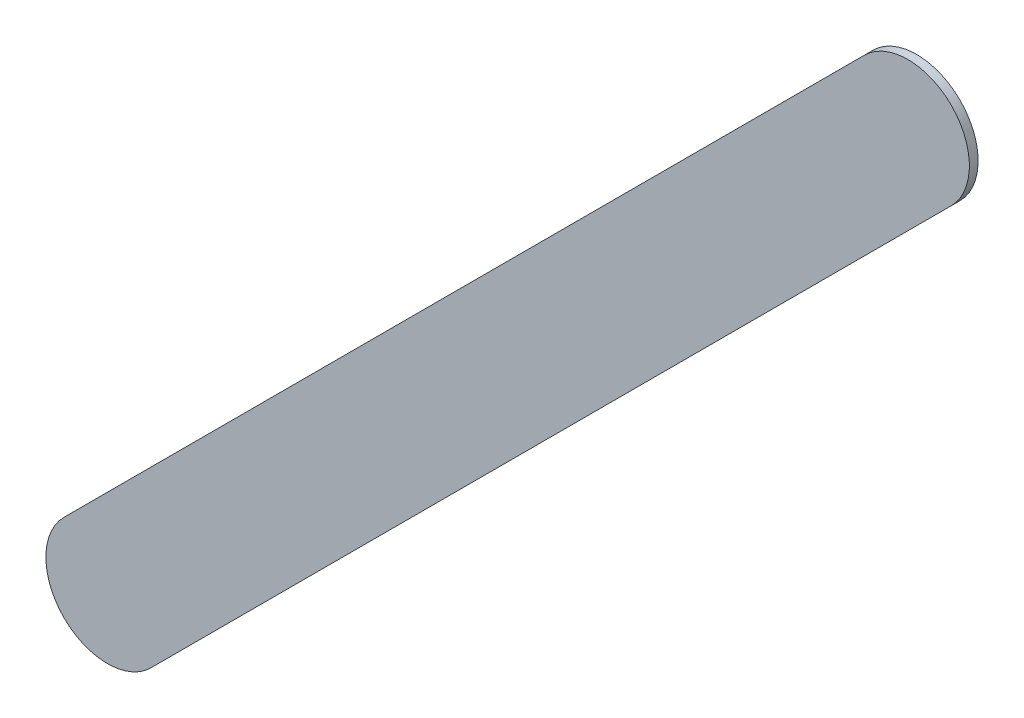
ISO-10303-21;
HEADER;
FILE_DESCRIPTION(('STEP AP214'),'2;1');
FILE_NAME('part.step','',(''),(''),'','','');
FILE_SCHEMA(('AUTOMOTIVE_DESIGN { 1 0 10303 214 1 1 1 1 }'));
ENDSEC;
DATA;
#1=APPLICATION_CONTEXT('core data for automotive mechanical design processes');
#2=APPLICATION_PROTOCOL_DEFINITION('international standard','automotive_design',2000,#1);
#3=PRODUCT_CONTEXT('',#1,'mechanical');
#4=PRODUCT('Part','Part','',(#3));
#5=PRODUCT_RELATED_PRODUCT_CATEGORY('part','',(#4));
#6=PRODUCT_DEFINITION_FORMATION('','',#4);
#7=PRODUCT_DEFINITION_CONTEXT('part definition',#1,'design');
#8=PRODUCT_DEFINITION('design','',#6,#7);
#9=PRODUCT_DEFINITION_SHAPE('','',#8);
#10=(LENGTH_UNIT() NAMED_UNIT(*) SI_UNIT(.MILLI.,.METRE.));
#11=(NAMED_UNIT(*) PLANE_ANGLE_UNIT() SI_UNIT($,.RADIAN.));
#12=(NAMED_UNIT(*) SI_UNIT($,.STERADIAN.) SOLID_ANGLE_UNIT());
#13=UNCERTAINTY_MEASURE_WITH_UNIT(LENGTH_MEASURE(1.E-05),#10,'distance_accuracy_value','');
#14=(GEOMETRIC_REPRESENTATION_CONTEXT(3) GLOBAL_UNCERTAINTY_ASSIGNED_CONTEXT((#13)) GLOBAL_UNIT_ASSIGNED_CONTEXT((#10,
#11,#12)) REPRESENTATION_CONTEXT('',''));
#15=CARTESIAN_POINT('',(0.,0.,0.));
#16=DIRECTION('',(0.,0.,1.));
#17=DIRECTION('',(1.,0.,0.));
#18=AXIS2_PLACEMENT_3D('',#15,#16,#17);
#19=CARTESIAN_POINT('',(87.72410954,109.8009869,0.));
#20=DIRECTION('',(-0.707106781186548,0.707106781186548,0.));
#21=DIRECTION('',(0.707106781186548,0.707106781186548,0.));
#22=AXIS2_PLACEMENT_3D('',#19,#20,#21);
#23=PLANE('',#22);
#24=DIRECTION('',(0.707106781186548,0.707106781186548,0.));
#25=VECTOR('',#24,1.);
#26=CARTESIAN_POINT('',(87.72410954,109.8009869,0.03556));
#27=LINE('',#26,#25);
#28=CARTESIAN_POINT('',(87.72410954,109.8009869,0.03556));
#29=VERTEX_POINT('',#28);
#30=CARTESIAN_POINT('',(90.98035652,113.05723388,0.03556));
#31=VERTEX_POINT('',#30);
#32=EDGE_CURVE('E11',#29,#31,#27,.T.);
#33=ORIENTED_EDGE('',*,*,#32,.F.);
#34=DIRECTION('',(0.,0.,1.));
#35=VECTOR('',#34,1.);
#36=CARTESIAN_POINT('',(87.72410954,109.8009869,0.));
#37=LINE('',#36,#35);
#38=CARTESIAN_POINT('',(87.72410954,109.8009869,0.));
#39=VERTEX_POINT('',#38);
#40=EDGE_CURVE('E24',#39,#29,#37,.T.);
#41=ORIENTED_EDGE('',*,*,#40,.F.);
#42=DIRECTION('',(0.707106781186548,0.707106781186548,0.));
#43=VECTOR('',#42,1.);
#44=CARTESIAN_POINT('',(87.72410954,109.8009869,0.));
#45=LINE('',#44,#43);
#46=CARTESIAN_POINT('',(90.98035652,113.05723388,0.));
#47=VERTEX_POINT('',#46);
#48=EDGE_CURVE('E75',#39,#47,#45,.T.);
#49=ORIENTED_EDGE('',*,*,#48,.T.);
#50=DIRECTION('',(0.,0.,1.));
#51=VECTOR('',#50,1.);
#52=CARTESIAN_POINT('',(90.98035652,113.05723388,0.));
#53=LINE('',#52,#51);
#54=EDGE_CURVE('E37',#47,#31,#53,.T.);
#55=ORIENTED_EDGE('',*,*,#54,.T.);
#56=EDGE_LOOP('',(#33,#41,#49,#55));
#57=FACE_BOUND('',#56,.T.);
#58=ADVANCED_FACE('F17',(#57),#23,.F.);
#59=CARTESIAN_POINT('',(90.80358014,113.23401026,0.));
#60=DIRECTION('',(0.,0.,-1.));
#61=DIRECTION('',(0.707106781186576,-0.707106781186519,0.));
#62=AXIS2_PLACEMENT_3D('',#59,#60,#61);
#63=CYLINDRICAL_SURFACE('',#62,0.249999554103226);
#64=CARTESIAN_POINT('',(90.80358014,113.23401026,0.03556));
#65=DIRECTION('',(0.,0.,1.));
#66=DIRECTION('',(0.707106781186576,-0.707106781186519,0.));
#67=AXIS2_PLACEMENT_3D('',#64,#65,#66);
#68=CIRCLE('',#67,0.249999554103226);
#69=CARTESIAN_POINT('',(90.62680376,113.41078664,0.03556));
#70=VERTEX_POINT('',#69);
#71=EDGE_CURVE('E83',#31,#70,#68,.T.);
#72=ORIENTED_EDGE('',*,*,#71,.F.);
#73=ORIENTED_EDGE('',*,*,#54,.F.);
#74=CARTESIAN_POINT('',(90.80358014,113.23401026,0.));
#75=DIRECTION('',(0.,0.,1.));
#76=DIRECTION('',(0.707106781186576,-0.707106781186519,0.));
#77=AXIS2_PLACEMENT_3D('',#74,#75,#76);
#78=CIRCLE('',#77,0.249999554103226);
#79=CARTESIAN_POINT('',(90.62680376,113.41078664,0.));
#80=VERTEX_POINT('',#79);
#81=EDGE_CURVE('E81',#47,#80,#78,.T.);
#82=ORIENTED_EDGE('',*,*,#81,.T.);
#83=DIRECTION('',(0.,0.,1.));
#84=VECTOR('',#83,1.);
#85=CARTESIAN_POINT('',(90.62680376,113.41078664,0.));
#86=LINE('',#85,#84);
#87=EDGE_CURVE('E67',#80,#70,#86,.T.);
#88=ORIENTED_EDGE('',*,*,#87,.T.);
#89=EDGE_LOOP('',(#72,#73,#82,#88));
#90=FACE_BOUND('',#89,.T.);
#91=ADVANCED_FACE('F89',(#90),#63,.T.);
#92=CARTESIAN_POINT('',(90.62680376,113.41078664,0.));
#93=DIRECTION('',(0.707106781186551,-0.707106781186544,0.));
#94=DIRECTION('',(-0.707106781186544,-0.707106781186551,0.));
#95=AXIS2_PLACEMENT_3D('',#92,#93,#94);
#96=PLANE('',#95);
#97=DIRECTION('',(-0.707106781186544,-0.707106781186551,0.));
#98=VECTOR('',#97,1.);
#99=CARTESIAN_POINT('',(90.62680376,113.41078664,0.03556));
#100=LINE('',#99,#98);
#101=CARTESIAN_POINT('',(87.37055678,110.15453966,0.03556));
#102=VERTEX_POINT('',#101);
#103=EDGE_CURVE('E71',#70,#102,#100,.T.);
#104=ORIENTED_EDGE('',*,*,#103,.F.);
#105=ORIENTED_EDGE('',*,*,#87,.F.);
#106=DIRECTION('',(-0.707106781186544,-0.707106781186551,0.));
#107=VECTOR('',#106,1.);
#108=CARTESIAN_POINT('',(90.62680376,113.41078664,0.));
#109=LINE('',#108,#107);
#110=CARTESIAN_POINT('',(87.37055678,110.15453966,0.));
#111=VERTEX_POINT('',#110);
#112=EDGE_CURVE('E63',#80,#111,#109,.T.);
#113=ORIENTED_EDGE('',*,*,#112,.T.);
#114=DIRECTION('',(0.,0.,1.));
#115=VECTOR('',#114,1.);
#116=CARTESIAN_POINT('',(87.37055678,110.15453966,0.));
#117=LINE('',#116,#115);
#118=EDGE_CURVE('E53',#111,#102,#117,.T.);
#119=ORIENTED_EDGE('',*,*,#118,.T.);
#120=EDGE_LOOP('',(#104,#105,#113,#119));
#121=FACE_BOUND('',#120,.T.);
#122=ADVANCED_FACE('F66',(#121),#96,.F.);
#123=CARTESIAN_POINT('',(87.54733316,109.97776328,0.));
#124=DIRECTION('',(0.,0.,-1.));
#125=DIRECTION('',(-0.707106781186548,0.707106781186548,0.));
#126=AXIS2_PLACEMENT_3D('',#123,#124,#125);
#127=CYLINDRICAL_SURFACE('',#126,0.249999554103213);
#128=CARTESIAN_POINT('',(87.54733316,109.97776328,0.03556));
#129=DIRECTION('',(0.,0.,1.));
#130=DIRECTION('',(-0.707106781186548,0.707106781186548,0.));
#131=AXIS2_PLACEMENT_3D('',#128,#129,#130);
#132=CIRCLE('',#131,0.249999554103213);
#133=EDGE_CURVE('E59',#102,#29,#132,.T.);
#134=ORIENTED_EDGE('',*,*,#133,.F.);
#135=ORIENTED_EDGE('',*,*,#118,.F.);
#136=CARTESIAN_POINT('',(87.54733316,109.97776328,0.));
#137=DIRECTION('',(0.,0.,1.));
#138=DIRECTION('',(-0.707106781186548,0.707106781186548,0.));
#139=AXIS2_PLACEMENT_3D('',#136,#137,#138);
#140=CIRCLE('',#139,0.249999554103213);
#141=EDGE_CURVE('E57',#111,#39,#140,.T.);
#142=ORIENTED_EDGE('',*,*,#141,.T.);
#143=ORIENTED_EDGE('',*,*,#40,.T.);
#144=EDGE_LOOP('',(#134,#135,#142,#143));
#145=FACE_BOUND('',#144,.T.);
#146=ADVANCED_FACE('F55',(#145),#127,.T.);
#147=CARTESIAN_POINT('',(87.72410954,109.8009869,0.));
#148=DIRECTION('',(0.,0.,-1.));
#149=DIRECTION('',(-1.,0.,0.));
#150=AXIS2_PLACEMENT_3D('',#147,#148,#149);
#151=PLANE('',#150);
#152=ORIENTED_EDGE('',*,*,#141,.F.);
#153=ORIENTED_EDGE('',*,*,#112,.F.);
#154=ORIENTED_EDGE('',*,*,#81,.F.);
#155=ORIENTED_EDGE('',*,*,#48,.F.);
#156=EDGE_LOOP('',(#152,#153,#154,#155));
#157=FACE_BOUND('',#156,.T.);
#158=ADVANCED_FACE('F74',(#157),#151,.T.);
#159=CARTESIAN_POINT('',(87.72410954,109.8009869,0.03556));
#160=DIRECTION('',(0.,0.,-1.));
#161=DIRECTION('',(-1.,0.,0.));
#162=AXIS2_PLACEMENT_3D('',#159,#160,#161);
#163=PLANE('',#162);
#164=ORIENTED_EDGE('',*,*,#32,.T.);
#165=ORIENTED_EDGE('',*,*,#71,.T.);
#166=ORIENTED_EDGE('',*,*,#103,.T.);
#167=ORIENTED_EDGE('',*,*,#133,.T.);
#168=EDGE_LOOP('',(#164,#165,#166,#167));
#169=FACE_BOUND('',#168,.T.);
#170=ADVANCED_FACE('F91',(#169),#163,.F.);
#171=CLOSED_SHELL('',(#58,#91,#122,#146,#158,#170));
#172=MANIFOLD_SOLID_BREP('B1',#171);
#173=ADVANCED_BREP_SHAPE_REPRESENTATION('',(#18,#172),#14);
#174=SHAPE_DEFINITION_REPRESENTATION(#9,#173);
ENDSEC;
END-ISO-10303-21;
